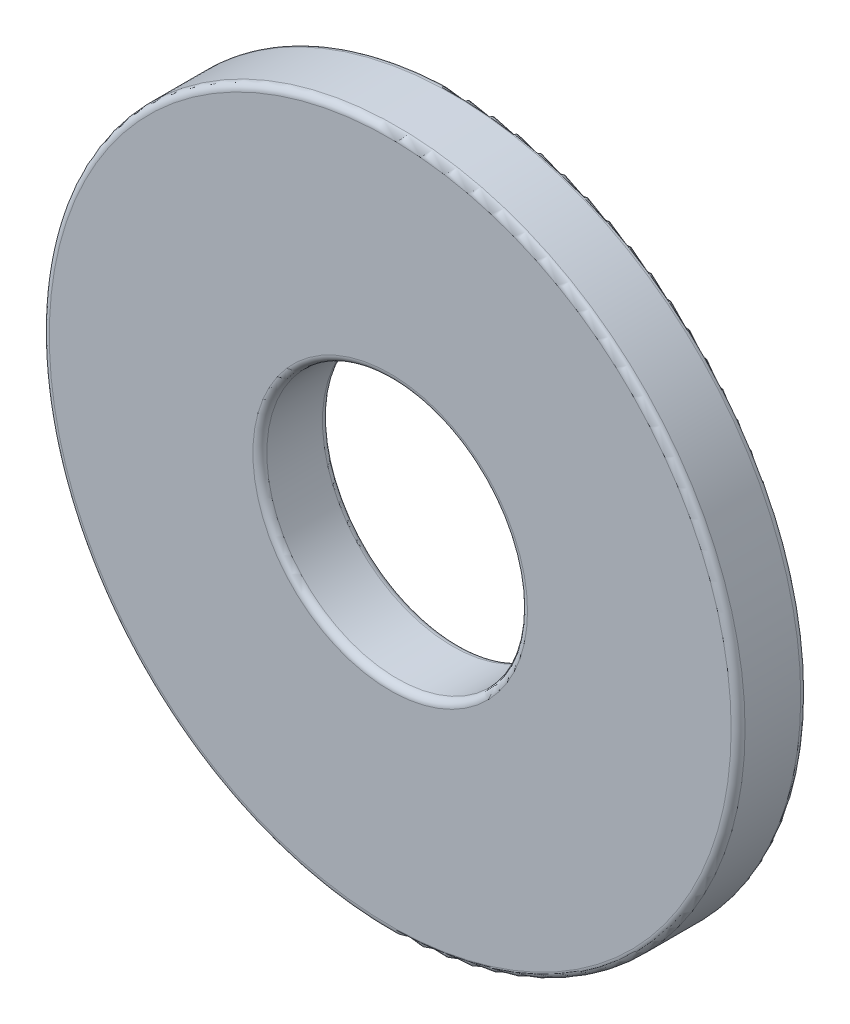
ISO-10303-21;
HEADER;
FILE_DESCRIPTION(('STEP AP214'),'2;1');
FILE_NAME('part.step','',(''),(''),'','','');
FILE_SCHEMA(('AUTOMOTIVE_DESIGN { 1 0 10303 214 1 1 1 1 }'));
ENDSEC;
DATA;
#1=APPLICATION_CONTEXT('core data for automotive mechanical design processes');
#2=APPLICATION_PROTOCOL_DEFINITION('international standard','automotive_design',2000,#1);
#3=PRODUCT_CONTEXT('',#1,'mechanical');
#4=PRODUCT('Part','Part','',(#3));
#5=PRODUCT_RELATED_PRODUCT_CATEGORY('part','',(#4));
#6=PRODUCT_DEFINITION_FORMATION('','',#4);
#7=PRODUCT_DEFINITION_CONTEXT('part definition',#1,'design');
#8=PRODUCT_DEFINITION('design','',#6,#7);
#9=PRODUCT_DEFINITION_SHAPE('','',#8);
#10=(LENGTH_UNIT() NAMED_UNIT(*) SI_UNIT(.MILLI.,.METRE.));
#11=(NAMED_UNIT(*) PLANE_ANGLE_UNIT() SI_UNIT($,.RADIAN.));
#12=(NAMED_UNIT(*) SI_UNIT($,.STERADIAN.) SOLID_ANGLE_UNIT());
#13=UNCERTAINTY_MEASURE_WITH_UNIT(LENGTH_MEASURE(1.E-05),#10,'distance_accuracy_value','');
#14=(GEOMETRIC_REPRESENTATION_CONTEXT(3) GLOBAL_UNCERTAINTY_ASSIGNED_CONTEXT((#13)) GLOBAL_UNIT_ASSIGNED_CONTEXT((#10,
#11,#12)) REPRESENTATION_CONTEXT('',''));
#15=CARTESIAN_POINT('',(0.,0.,0.));
#16=DIRECTION('',(0.,0.,1.));
#17=DIRECTION('',(1.,0.,0.));
#18=AXIS2_PLACEMENT_3D('',#15,#16,#17);
#19=CARTESIAN_POINT('',(0.,0.,-0.952500000000003));
#20=DIRECTION('',(0.,0.,1.));
#21=DIRECTION('',(1.,0.,0.));
#22=AXIS2_PLACEMENT_3D('',#19,#20,#21);
#23=CYLINDRICAL_SURFACE('',#22,9.525);
#24=CARTESIAN_POINT('',(0.,0.,0.762000000000004));
#25=DIRECTION('',(0.,0.,1.));
#26=DIRECTION('',(1.,0.,0.));
#27=AXIS2_PLACEMENT_3D('',#24,#25,#26);
#28=CIRCLE('',#27,9.525);
#29=CARTESIAN_POINT('',(9.525,0.,0.762000000000004));
#30=VERTEX_POINT('',#29);
#31=EDGE_CURVE('E10',#30,#30,#28,.F.);
#32=ORIENTED_EDGE('',*,*,#31,.T.);
#33=EDGE_LOOP('',(#32));
#34=FACE_BOUND('',#33,.T.);
#35=CARTESIAN_POINT('',(0.,0.,-0.762000000000003));
#36=DIRECTION('',(0.,0.,1.));
#37=DIRECTION('',(1.,0.,0.));
#38=AXIS2_PLACEMENT_3D('',#35,#36,#37);
#39=CIRCLE('',#38,9.525);
#40=CARTESIAN_POINT('',(9.525,0.,-0.762000000000003));
#41=VERTEX_POINT('',#40);
#42=EDGE_CURVE('E37',#41,#41,#39,.T.);
#43=ORIENTED_EDGE('',*,*,#42,.T.);
#44=EDGE_LOOP('',(#43));
#45=FACE_BOUND('',#44,.T.);
#46=ADVANCED_FACE('F30',(#34,#45),#23,.T.);
#47=CARTESIAN_POINT('',(0.,0.,-0.952500000000003));
#48=DIRECTION('',(0.,0.,1.));
#49=DIRECTION('',(1.,0.,0.));
#50=AXIS2_PLACEMENT_3D('',#47,#48,#49);
#51=PLANE('',#50);
#52=CARTESIAN_POINT('',(0.,0.,-0.952500000000003));
#53=DIRECTION('',(0.,0.,1.));
#54=DIRECTION('',(1.,0.,0.));
#55=AXIS2_PLACEMENT_3D('',#52,#53,#54);
#56=CIRCLE('',#55,3.7592);
#57=CARTESIAN_POINT('',(3.7592,0.,-0.952500000000003));
#58=VERTEX_POINT('',#57);
#59=EDGE_CURVE('E41',#58,#58,#56,.T.);
#60=ORIENTED_EDGE('',*,*,#59,.T.);
#61=EDGE_LOOP('',(#60));
#62=FACE_BOUND('',#61,.T.);
#63=CARTESIAN_POINT('',(0.,0.,-0.952500000000003));
#64=DIRECTION('',(0.,0.,1.));
#65=DIRECTION('',(1.,0.,0.));
#66=AXIS2_PLACEMENT_3D('',#63,#64,#65);
#67=CIRCLE('',#66,9.3345);
#68=CARTESIAN_POINT('',(9.3345,0.,-0.952500000000003));
#69=VERTEX_POINT('',#68);
#70=EDGE_CURVE('E45',#69,#69,#67,.F.);
#71=ORIENTED_EDGE('',*,*,#70,.T.);
#72=EDGE_LOOP('',(#71));
#73=FACE_BOUND('',#72,.T.);
#74=ADVANCED_FACE('F73',(#62,#73),#51,.F.);
#75=CARTESIAN_POINT('',(0.,0.,0.952500000000004));
#76=DIRECTION('',(0.,0.,1.));
#77=DIRECTION('',(1.,0.,0.));
#78=AXIS2_PLACEMENT_3D('',#75,#76,#77);
#79=PLANE('',#78);
#80=CARTESIAN_POINT('',(0.,0.,0.952500000000004));
#81=DIRECTION('',(0.,0.,1.));
#82=DIRECTION('',(1.,0.,0.));
#83=AXIS2_PLACEMENT_3D('',#80,#81,#82);
#84=CIRCLE('',#83,3.7592);
#85=CARTESIAN_POINT('',(3.7592,0.,0.952500000000004));
#86=VERTEX_POINT('',#85);
#87=EDGE_CURVE('E50',#86,#86,#84,.F.);
#88=ORIENTED_EDGE('',*,*,#87,.T.);
#89=EDGE_LOOP('',(#88));
#90=FACE_BOUND('',#89,.T.);
#91=CARTESIAN_POINT('',(0.,0.,0.952500000000004));
#92=DIRECTION('',(0.,0.,1.));
#93=DIRECTION('',(1.,0.,0.));
#94=AXIS2_PLACEMENT_3D('',#91,#92,#93);
#95=CIRCLE('',#94,9.3345);
#96=CARTESIAN_POINT('',(9.3345,0.,0.952500000000004));
#97=VERTEX_POINT('',#96);
#98=EDGE_CURVE('E53',#97,#97,#95,.T.);
#99=ORIENTED_EDGE('',*,*,#98,.T.);
#100=EDGE_LOOP('',(#99));
#101=FACE_BOUND('',#100,.T.);
#102=ADVANCED_FACE('F76',(#90,#101),#79,.T.);
#103=CARTESIAN_POINT('',(0.,0.,-0.952500000000003));
#104=DIRECTION('',(0.,0.,1.));
#105=DIRECTION('',(1.,0.,0.));
#106=AXIS2_PLACEMENT_3D('',#103,#104,#105);
#107=CYLINDRICAL_SURFACE('',#106,3.5687);
#108=CARTESIAN_POINT('',(0.,0.,0.762000000000004));
#109=DIRECTION('',(0.,0.,1.));
#110=DIRECTION('',(1.,0.,0.));
#111=AXIS2_PLACEMENT_3D('',#108,#109,#110);
#112=CIRCLE('',#111,3.5687);
#113=CARTESIAN_POINT('',(3.5687,0.,0.762000000000004));
#114=VERTEX_POINT('',#113);
#115=EDGE_CURVE('E56',#114,#114,#112,.T.);
#116=ORIENTED_EDGE('',*,*,#115,.T.);
#117=EDGE_LOOP('',(#116));
#118=FACE_BOUND('',#117,.T.);
#119=CARTESIAN_POINT('',(0.,0.,-0.762000000000003));
#120=DIRECTION('',(0.,0.,1.));
#121=DIRECTION('',(1.,0.,0.));
#122=AXIS2_PLACEMENT_3D('',#119,#120,#121);
#123=CIRCLE('',#122,3.5687);
#124=CARTESIAN_POINT('',(3.5687,0.,-0.762000000000003));
#125=VERTEX_POINT('',#124);
#126=EDGE_CURVE('E59',#125,#125,#123,.F.);
#127=ORIENTED_EDGE('',*,*,#126,.T.);
#128=EDGE_LOOP('',(#127));
#129=FACE_BOUND('',#128,.T.);
#130=ADVANCED_FACE('F63',(#118,#129),#107,.F.);
#131=CARTESIAN_POINT('',(0.,0.,0.762000000000004));
#132=DIRECTION('',(0.,0.,1.));
#133=DIRECTION('',(1.,0.,0.));
#134=AXIS2_PLACEMENT_3D('',#131,#132,#133);
#135=TOROIDAL_SURFACE('',#134,3.7592,0.1905);
#136=ORIENTED_EDGE('',*,*,#87,.F.);
#137=EDGE_LOOP('',(#136));
#138=FACE_BOUND('',#137,.T.);
#139=ORIENTED_EDGE('',*,*,#115,.F.);
#140=EDGE_LOOP('',(#139));
#141=FACE_BOUND('',#140,.T.);
#142=ADVANCED_FACE('F69',(#138,#141),#135,.T.);
#143=CARTESIAN_POINT('',(0.,0.,-0.762000000000003));
#144=DIRECTION('',(0.,0.,1.));
#145=DIRECTION('',(1.,0.,0.));
#146=AXIS2_PLACEMENT_3D('',#143,#144,#145);
#147=TOROIDAL_SURFACE('',#146,3.7592,0.1905);
#148=ORIENTED_EDGE('',*,*,#126,.F.);
#149=EDGE_LOOP('',(#148));
#150=FACE_BOUND('',#149,.T.);
#151=ORIENTED_EDGE('',*,*,#59,.F.);
#152=EDGE_LOOP('',(#151));
#153=FACE_BOUND('',#152,.T.);
#154=ADVANCED_FACE('F65',(#150,#153),#147,.T.);
#155=CARTESIAN_POINT('',(0.,0.,0.762000000000004));
#156=DIRECTION('',(0.,0.,1.));
#157=DIRECTION('',(1.,0.,0.));
#158=AXIS2_PLACEMENT_3D('',#155,#156,#157);
#159=TOROIDAL_SURFACE('',#158,9.3345,0.1905);
#160=ORIENTED_EDGE('',*,*,#31,.F.);
#161=EDGE_LOOP('',(#160));
#162=FACE_BOUND('',#161,.T.);
#163=ORIENTED_EDGE('',*,*,#98,.F.);
#164=EDGE_LOOP('',(#163));
#165=FACE_BOUND('',#164,.T.);
#166=ADVANCED_FACE('F68',(#162,#165),#159,.T.);
#167=CARTESIAN_POINT('',(0.,0.,-0.762000000000003));
#168=DIRECTION('',(0.,0.,1.));
#169=DIRECTION('',(1.,0.,0.));
#170=AXIS2_PLACEMENT_3D('',#167,#168,#169);
#171=TOROIDAL_SURFACE('',#170,9.3345,0.1905);
#172=ORIENTED_EDGE('',*,*,#70,.F.);
#173=EDGE_LOOP('',(#172));
#174=FACE_BOUND('',#173,.T.);
#175=ORIENTED_EDGE('',*,*,#42,.F.);
#176=EDGE_LOOP('',(#175));
#177=FACE_BOUND('',#176,.T.);
#178=ADVANCED_FACE('F32',(#174,#177),#171,.T.);
#179=CLOSED_SHELL('',(#46,#74,#102,#130,#142,#154,#166,#178));
#180=MANIFOLD_SOLID_BREP('B2',#179);
#181=ADVANCED_BREP_SHAPE_REPRESENTATION('',(#18,#180),#14);
#182=SHAPE_DEFINITION_REPRESENTATION(#9,#181);
ENDSEC;
END-ISO-10303-21;
